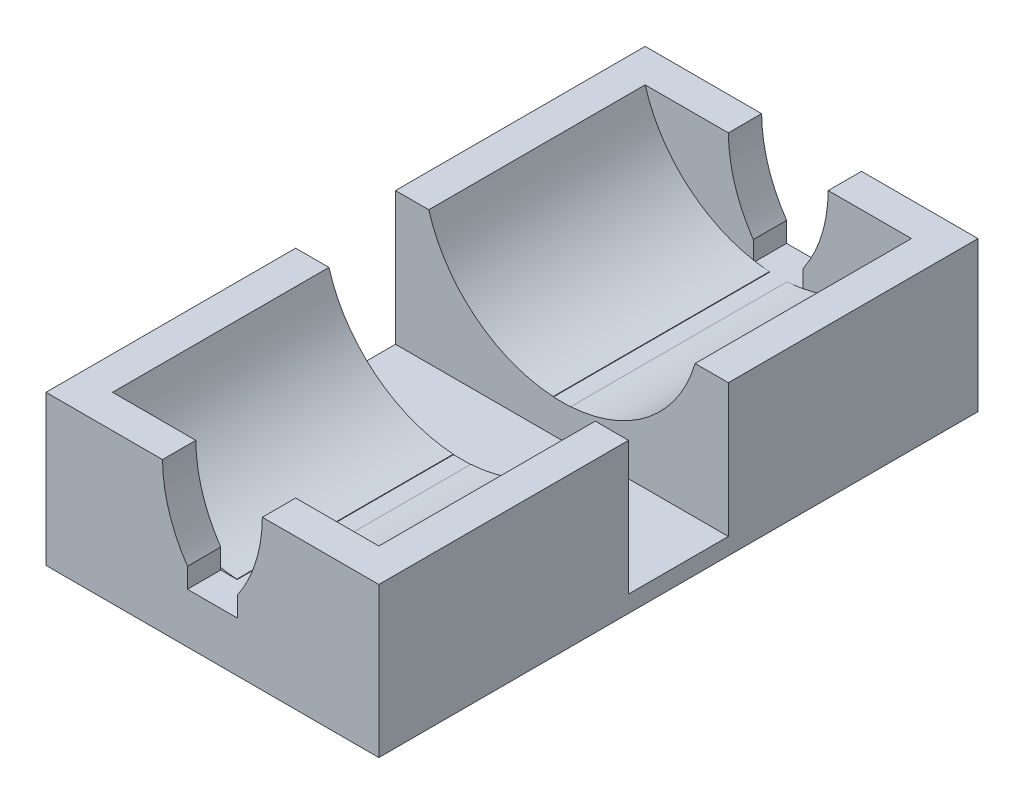
ISO-10303-21;
HEADER;
FILE_DESCRIPTION(('STEP AP214'),'2;1');
FILE_NAME('part.step','',(''),(''),'','','');
FILE_SCHEMA(('AUTOMOTIVE_DESIGN { 1 0 10303 214 1 1 1 1 }'));
ENDSEC;
DATA;
#1=APPLICATION_CONTEXT('core data for automotive mechanical design processes');
#2=APPLICATION_PROTOCOL_DEFINITION('international standard','automotive_design',2000,#1);
#3=PRODUCT_CONTEXT('',#1,'mechanical');
#4=PRODUCT('Part','Part','',(#3));
#5=PRODUCT_RELATED_PRODUCT_CATEGORY('part','',(#4));
#6=PRODUCT_DEFINITION_FORMATION('','',#4);
#7=PRODUCT_DEFINITION_CONTEXT('part definition',#1,'design');
#8=PRODUCT_DEFINITION('design','',#6,#7);
#9=PRODUCT_DEFINITION_SHAPE('','',#8);
#10=(LENGTH_UNIT() NAMED_UNIT(*) SI_UNIT(.MILLI.,.METRE.));
#11=(NAMED_UNIT(*) PLANE_ANGLE_UNIT() SI_UNIT($,.RADIAN.));
#12=(NAMED_UNIT(*) SI_UNIT($,.STERADIAN.) SOLID_ANGLE_UNIT());
#13=UNCERTAINTY_MEASURE_WITH_UNIT(LENGTH_MEASURE(1.E-05),#10,'distance_accuracy_value','');
#14=(GEOMETRIC_REPRESENTATION_CONTEXT(3) GLOBAL_UNCERTAINTY_ASSIGNED_CONTEXT((#13)) GLOBAL_UNIT_ASSIGNED_CONTEXT((#10,
#11,#12)) REPRESENTATION_CONTEXT('',''));
#15=CARTESIAN_POINT('',(0.,0.,0.));
#16=DIRECTION('',(0.,0.,1.));
#17=DIRECTION('',(1.,0.,0.));
#18=AXIS2_PLACEMENT_3D('',#15,#16,#17);
#19=CARTESIAN_POINT('',(-135.,56.7125441861068,120.893267690185));
#20=DIRECTION('',(0.,0.,-1.));
#21=DIRECTION('',(-1.,0.,0.));
#22=AXIS2_PLACEMENT_3D('',#19,#20,#21);
#23=CYLINDRICAL_SURFACE('',#22,41.6666666666667);
#24=CARTESIAN_POINT('',(-135.,56.7125441861068,-30.));
#25=DIRECTION('',(0.,0.,1.));
#26=DIRECTION('',(1.,0.,0.));
#27=AXIS2_PLACEMENT_3D('',#24,#25,#26);
#28=CIRCLE('',#27,41.6666666666667);
#29=CARTESIAN_POINT('',(-132.354628593983,15.12993819231,-30.));
#30=VERTEX_POINT('',#29);
#31=CARTESIAN_POINT('',(-95.,45.0458775194401,-30.));
#32=VERTEX_POINT('',#31);
#33=EDGE_CURVE('E596',#30,#32,#28,.T.);
#34=ORIENTED_EDGE('',*,*,#33,.F.);
#35=DIRECTION('',(0.,0.,1.));
#36=VECTOR('',#35,1.);
#37=CARTESIAN_POINT('',(-132.354628593983,15.12993819231,-45.));
#38=LINE('',#37,#36);
#39=CARTESIAN_POINT('',(-132.354628593983,15.12993819231,35.));
#40=VERTEX_POINT('',#39);
#41=EDGE_CURVE('E653',#30,#40,#38,.T.);
#42=ORIENTED_EDGE('',*,*,#41,.T.);
#43=CARTESIAN_POINT('',(-135.,56.7125441861068,35.));
#44=DIRECTION('',(0.,0.,1.));
#45=DIRECTION('',(1.,0.,0.));
#46=AXIS2_PLACEMENT_3D('',#43,#44,#45);
#47=CIRCLE('',#46,41.6666666666667);
#48=CARTESIAN_POINT('',(-127.5,15.726435428247,35.));
#49=VERTEX_POINT('',#48);
#50=EDGE_CURVE('E419',#40,#49,#47,.T.);
#51=ORIENTED_EDGE('',*,*,#50,.T.);
#52=CARTESIAN_POINT('',(-95.,45.0458775194401,35.));
#53=VERTEX_POINT('',#52);
#54=EDGE_CURVE('E601',#49,#53,#47,.T.);
#55=ORIENTED_EDGE('',*,*,#54,.T.);
#56=DIRECTION('',(0.,0.,1.));
#57=VECTOR('',#56,1.);
#58=CARTESIAN_POINT('',(-95.,45.0458775194401,35.));
#59=LINE('',#58,#57);
#60=EDGE_CURVE('E466',#32,#53,#59,.T.);
#61=ORIENTED_EDGE('',*,*,#60,.F.);
#62=EDGE_LOOP('',(#34,#42,#51,#55,#61));
#63=FACE_BOUND('',#62,.T.);
#64=ADVANCED_FACE('F43',(#63),#23,.F.);
#65=CARTESIAN_POINT('',(-185.,15.0458775194401,-135.));
#66=DIRECTION('',(0.,0.,1.));
#67=DIRECTION('',(1.,0.,0.));
#68=AXIS2_PLACEMENT_3D('',#65,#66,#67);
#69=PLANE('',#68);
#70=CARTESIAN_POINT('',(-163.040609981597,45.3116426667176,-135.));
#71=DIRECTION('',(0.,0.,1.));
#72=DIRECTION('',(1.,0.,0.));
#73=AXIS2_PLACEMENT_3D('',#70,#71,#72);
#74=CIRCLE('',#73,43.0414304908823);
#75=CARTESIAN_POINT('',(-120.,45.0458775194401,-135.));
#76=VERTEX_POINT('',#75);
#77=CARTESIAN_POINT('',(-127.5,21.0334676768741,-135.));
#78=VERTEX_POINT('',#77);
#79=EDGE_CURVE('E266',#76,#78,#74,.F.);
#80=ORIENTED_EDGE('',*,*,#79,.F.);
#81=DIRECTION('',(-1.,0.,0.));
#82=VECTOR('',#81,1.);
#83=CARTESIAN_POINT('',(-127.5,45.0458775194401,-135.));
#84=LINE('',#83,#82);
#85=CARTESIAN_POINT('',(-85.,45.0458775194401,-135.));
#86=VERTEX_POINT('',#85);
#87=EDGE_CURVE('E280',#86,#76,#84,.T.);
#88=ORIENTED_EDGE('',*,*,#87,.F.);
#89=DIRECTION('',(0.,-1.,0.));
#90=VECTOR('',#89,1.);
#91=CARTESIAN_POINT('',(-85.,45.0458775194401,-135.));
#92=LINE('',#91,#90);
#93=CARTESIAN_POINT('',(-85.,0.,-135.));
#94=VERTEX_POINT('',#93);
#95=EDGE_CURVE('E320',#86,#94,#92,.T.);
#96=ORIENTED_EDGE('',*,*,#95,.T.);
#97=DIRECTION('',(-1.,0.,0.));
#98=VECTOR('',#97,1.);
#99=CARTESIAN_POINT('',(-185.,0.,-135.));
#100=LINE('',#99,#98);
#101=CARTESIAN_POINT('',(-185.,0.,-135.));
#102=VERTEX_POINT('',#101);
#103=EDGE_CURVE('E393',#94,#102,#100,.T.);
#104=ORIENTED_EDGE('',*,*,#103,.T.);
#105=DIRECTION('',(0.,-1.,0.));
#106=VECTOR('',#105,1.);
#107=CARTESIAN_POINT('',(-185.,15.0458775194401,-135.));
#108=LINE('',#107,#106);
#109=CARTESIAN_POINT('',(-185.,45.0458775194401,-135.));
#110=VERTEX_POINT('',#109);
#111=EDGE_CURVE('E392',#110,#102,#108,.T.);
#112=ORIENTED_EDGE('',*,*,#111,.F.);
#113=DIRECTION('',(-1.,0.,0.));
#114=VECTOR('',#113,1.);
#115=CARTESIAN_POINT('',(-185.,45.0458775194401,-135.));
#116=LINE('',#115,#114);
#117=CARTESIAN_POINT('',(-150.,45.0458775194401,-135.));
#118=VERTEX_POINT('',#117);
#119=EDGE_CURVE('E332',#118,#110,#116,.T.);
#120=ORIENTED_EDGE('',*,*,#119,.F.);
#121=CARTESIAN_POINT('',(-106.959390018403,45.3116426667176,-135.));
#122=DIRECTION('',(0.,0.,1.));
#123=DIRECTION('',(1.,0.,0.));
#124=AXIS2_PLACEMENT_3D('',#121,#122,#123);
#125=CIRCLE('',#124,43.0414304908823);
#126=CARTESIAN_POINT('',(-142.5,21.0334676768742,-135.));
#127=VERTEX_POINT('',#126);
#128=EDGE_CURVE('E67',#118,#127,#125,.T.);
#129=ORIENTED_EDGE('',*,*,#128,.T.);
#130=DIRECTION('',(0.,-1.,0.));
#131=VECTOR('',#130,1.);
#132=CARTESIAN_POINT('',(-142.5,45.0458775194401,-135.));
#133=LINE('',#132,#131);
#134=CARTESIAN_POINT('',(-142.5,15.0458775194401,-135.));
#135=VERTEX_POINT('',#134);
#136=EDGE_CURVE('E348',#127,#135,#133,.T.);
#137=ORIENTED_EDGE('',*,*,#136,.T.);
#138=DIRECTION('',(-1.,0.,0.));
#139=VECTOR('',#138,1.);
#140=CARTESIAN_POINT('',(-185.,15.0458775194401,-135.));
#141=LINE('',#140,#139);
#142=CARTESIAN_POINT('',(-127.5,15.0458775194401,-135.));
#143=VERTEX_POINT('',#142);
#144=EDGE_CURVE('E389',#143,#135,#141,.T.);
#145=ORIENTED_EDGE('',*,*,#144,.F.);
#146=DIRECTION('',(0.,-1.,0.));
#147=VECTOR('',#146,1.);
#148=CARTESIAN_POINT('',(-127.5,45.0458775194401,-135.));
#149=LINE('',#148,#147);
#150=EDGE_CURVE('E283',#78,#143,#149,.T.);
#151=ORIENTED_EDGE('',*,*,#150,.F.);
#152=EDGE_LOOP('',(#80,#88,#96,#104,#112,#120,#129,#137,#145,#151));
#153=FACE_BOUND('',#152,.T.);
#154=ADVANCED_FACE('F279',(#153),#69,.F.);
#155=CARTESIAN_POINT('',(-175.,45.0458775194401,-30.));
#156=DIRECTION('',(0.,0.,1.));
#157=DIRECTION('',(1.,0.,0.));
#158=AXIS2_PLACEMENT_3D('',#155,#156,#157);
#159=PLANE('',#158);
#160=CARTESIAN_POINT('',(-163.040609981597,45.3116426667176,-30.));
#161=DIRECTION('',(0.,0.,1.));
#162=DIRECTION('',(1.,0.,0.));
#163=AXIS2_PLACEMENT_3D('',#160,#161,#162);
#164=CIRCLE('',#163,43.0414304908823);
#165=CARTESIAN_POINT('',(-132.437534993104,15.0458775194401,-30.));
#166=VERTEX_POINT('',#165);
#167=EDGE_CURVE('E650',#30,#166,#164,.F.);
#168=ORIENTED_EDGE('',*,*,#167,.F.);
#169=ORIENTED_EDGE('',*,*,#33,.T.);
#170=DIRECTION('',(-1.,0.,0.));
#171=VECTOR('',#170,1.);
#172=CARTESIAN_POINT('',(-95.,45.0458775194401,-30.));
#173=LINE('',#172,#171);
#174=CARTESIAN_POINT('',(-85.,45.0458775194401,-30.));
#175=VERTEX_POINT('',#174);
#176=EDGE_CURVE('E462',#175,#32,#173,.T.);
#177=ORIENTED_EDGE('',*,*,#176,.F.);
#178=DIRECTION('',(0.,-1.,0.));
#179=VECTOR('',#178,1.);
#180=CARTESIAN_POINT('',(-85.,45.0458775194401,-30.));
#181=LINE('',#180,#179);
#182=CARTESIAN_POINT('',(-85.,5.04587751944009,-30.));
#183=VERTEX_POINT('',#182);
#184=EDGE_CURVE('E483',#175,#183,#181,.T.);
#185=ORIENTED_EDGE('',*,*,#184,.T.);
#186=DIRECTION('',(1.,0.,0.));
#187=VECTOR('',#186,1.);
#188=CARTESIAN_POINT('',(-185.,5.04587751944009,-30.));
#189=LINE('',#188,#187);
#190=CARTESIAN_POINT('',(-185.,5.04587751944009,-30.));
#191=VERTEX_POINT('',#190);
#192=EDGE_CURVE('E580',#191,#183,#189,.T.);
#193=ORIENTED_EDGE('',*,*,#192,.F.);
#194=DIRECTION('',(0.,-1.,0.));
#195=VECTOR('',#194,1.);
#196=CARTESIAN_POINT('',(-185.,45.0458775194401,-30.));
#197=LINE('',#196,#195);
#198=CARTESIAN_POINT('',(-185.,45.0458775194401,-30.));
#199=VERTEX_POINT('',#198);
#200=EDGE_CURVE('E385',#199,#191,#197,.T.);
#201=ORIENTED_EDGE('',*,*,#200,.F.);
#202=DIRECTION('',(-1.,0.,0.));
#203=VECTOR('',#202,1.);
#204=CARTESIAN_POINT('',(-175.,45.0458775194401,-30.));
#205=LINE('',#204,#203);
#206=CARTESIAN_POINT('',(-175.,45.0458775194401,-30.));
#207=VERTEX_POINT('',#206);
#208=EDGE_CURVE('E363',#207,#199,#205,.T.);
#209=ORIENTED_EDGE('',*,*,#208,.F.);
#210=CARTESIAN_POINT('',(-137.645371406017,15.12993819231,-30.));
#211=VERTEX_POINT('',#210);
#212=EDGE_CURVE('E597',#207,#211,#28,.T.);
#213=ORIENTED_EDGE('',*,*,#212,.T.);
#214=CARTESIAN_POINT('',(-106.959390018403,45.3116426667176,-30.));
#215=DIRECTION('',(0.,0.,1.));
#216=DIRECTION('',(1.,0.,0.));
#217=AXIS2_PLACEMENT_3D('',#214,#215,#216);
#218=CIRCLE('',#217,43.0414304908823);
#219=CARTESIAN_POINT('',(-137.562465006895,15.0458775194401,-30.));
#220=VERTEX_POINT('',#219);
#221=EDGE_CURVE('E540',#211,#220,#218,.T.);
#222=ORIENTED_EDGE('',*,*,#221,.T.);
#223=DIRECTION('',(-1.,0.,0.));
#224=VECTOR('',#223,1.);
#225=CARTESIAN_POINT('',(-175.,15.0458775194401,-30.));
#226=LINE('',#225,#224);
#227=EDGE_CURVE('E656',#166,#220,#226,.T.);
#228=ORIENTED_EDGE('',*,*,#227,.F.);
#229=EDGE_LOOP('',(#168,#169,#177,#185,#193,#201,#209,#213,#222,#228));
#230=FACE_BOUND('',#229,.T.);
#231=ADVANCED_FACE('F704',(#230),#159,.F.);
#232=CARTESIAN_POINT('',(-185.,45.0458775194401,45.));
#233=DIRECTION('',(0.,0.,-1.));
#234=DIRECTION('',(-1.,0.,0.));
#235=AXIS2_PLACEMENT_3D('',#232,#233,#234);
#236=PLANE('',#235);
#237=CARTESIAN_POINT('',(-163.040609981597,45.3116426667176,45.0000000000001));
#238=DIRECTION('',(0.,0.,1.));
#239=DIRECTION('',(1.,0.,0.));
#240=AXIS2_PLACEMENT_3D('',#237,#238,#239);
#241=CIRCLE('',#240,43.0414304908823);
#242=CARTESIAN_POINT('',(-120.,45.0458775194401,45.));
#243=VERTEX_POINT('',#242);
#244=CARTESIAN_POINT('',(-127.5,21.0334676768741,45.0000000000001));
#245=VERTEX_POINT('',#244);
#246=EDGE_CURVE('E674',#243,#245,#241,.F.);
#247=ORIENTED_EDGE('',*,*,#246,.T.);
#248=DIRECTION('',(0.,-1.,0.));
#249=VECTOR('',#248,1.);
#250=CARTESIAN_POINT('',(-127.5,45.0458775194401,45.));
#251=LINE('',#250,#249);
#252=CARTESIAN_POINT('',(-127.5,15.0458775194401,45.));
#253=VERTEX_POINT('',#252);
#254=EDGE_CURVE('E474',#245,#253,#251,.T.);
#255=ORIENTED_EDGE('',*,*,#254,.T.);
#256=DIRECTION('',(1.,0.,0.));
#257=VECTOR('',#256,1.);
#258=CARTESIAN_POINT('',(0.,15.0458775194401,45.));
#259=LINE('',#258,#257);
#260=CARTESIAN_POINT('',(-142.5,15.0458775194401,45.));
#261=VERTEX_POINT('',#260);
#262=EDGE_CURVE('E588',#261,#253,#259,.T.);
#263=ORIENTED_EDGE('',*,*,#262,.F.);
#264=DIRECTION('',(0.,-1.,0.));
#265=VECTOR('',#264,1.);
#266=CARTESIAN_POINT('',(-142.5,45.0458775194401,45.));
#267=LINE('',#266,#265);
#268=CARTESIAN_POINT('',(-142.5,21.0334676768741,45.0000000000001));
#269=VERTEX_POINT('',#268);
#270=EDGE_CURVE('E379',#269,#261,#267,.T.);
#271=ORIENTED_EDGE('',*,*,#270,.F.);
#272=CARTESIAN_POINT('',(-106.959390018403,45.3116426667176,45.0000000000001));
#273=DIRECTION('',(0.,0.,1.));
#274=DIRECTION('',(1.,0.,0.));
#275=AXIS2_PLACEMENT_3D('',#272,#273,#274);
#276=CIRCLE('',#275,43.0414304908823);
#277=CARTESIAN_POINT('',(-150.,45.0458775194401,45.0000000000001));
#278=VERTEX_POINT('',#277);
#279=EDGE_CURVE('E285',#278,#269,#276,.T.);
#280=ORIENTED_EDGE('',*,*,#279,.F.);
#281=DIRECTION('',(1.,0.,0.));
#282=VECTOR('',#281,1.);
#283=CARTESIAN_POINT('',(-185.,45.0458775194401,45.));
#284=LINE('',#283,#282);
#285=CARTESIAN_POINT('',(-185.,45.0458775194401,45.));
#286=VERTEX_POINT('',#285);
#287=EDGE_CURVE('E369',#286,#278,#284,.T.);
#288=ORIENTED_EDGE('',*,*,#287,.F.);
#289=DIRECTION('',(0.,-1.,0.));
#290=VECTOR('',#289,1.);
#291=CARTESIAN_POINT('',(-185.,45.0458775194401,45.));
#292=LINE('',#291,#290);
#293=CARTESIAN_POINT('',(-185.,0.,45.));
#294=VERTEX_POINT('',#293);
#295=EDGE_CURVE('E382',#286,#294,#292,.T.);
#296=ORIENTED_EDGE('',*,*,#295,.T.);
#297=DIRECTION('',(-1.,0.,0.));
#298=VECTOR('',#297,1.);
#299=CARTESIAN_POINT('',(5.00000000000003,0.,45.));
#300=LINE('',#299,#298);
#301=CARTESIAN_POINT('',(-85.,0.,45.));
#302=VERTEX_POINT('',#301);
#303=EDGE_CURVE('E406',#302,#294,#300,.T.);
#304=ORIENTED_EDGE('',*,*,#303,.F.);
#305=DIRECTION('',(0.,-1.,0.));
#306=VECTOR('',#305,1.);
#307=CARTESIAN_POINT('',(-85.,45.0458775194401,45.));
#308=LINE('',#307,#306);
#309=CARTESIAN_POINT('',(-85.,45.0458775194401,45.));
#310=VERTEX_POINT('',#309);
#311=EDGE_CURVE('E312',#310,#302,#308,.T.);
#312=ORIENTED_EDGE('',*,*,#311,.F.);
#313=DIRECTION('',(1.,0.,0.));
#314=VECTOR('',#313,1.);
#315=CARTESIAN_POINT('',(-127.5,45.0458775194401,45.));
#316=LINE('',#315,#314);
#317=EDGE_CURVE('E456',#243,#310,#316,.T.);
#318=ORIENTED_EDGE('',*,*,#317,.F.);
#319=EDGE_LOOP('',(#247,#255,#263,#271,#280,#288,#296,#304,#312,#318));
#320=FACE_BOUND('',#319,.T.);
#321=ADVANCED_FACE('F497',(#320),#236,.F.);
#322=CARTESIAN_POINT('',(-175.,45.0458775194401,-60.));
#323=DIRECTION('',(0.,0.,-1.));
#324=DIRECTION('',(-1.,0.,0.));
#325=AXIS2_PLACEMENT_3D('',#322,#323,#324);
#326=PLANE('',#325);
#327=CARTESIAN_POINT('',(-163.040609981597,45.3116426667176,-60.));
#328=DIRECTION('',(0.,0.,-1.));
#329=DIRECTION('',(-1.,0.,0.));
#330=AXIS2_PLACEMENT_3D('',#327,#328,#329);
#331=CIRCLE('',#330,43.0414304908823);
#332=CARTESIAN_POINT('',(-132.437534993104,15.0458775194401,-60.));
#333=VERTEX_POINT('',#332);
#334=CARTESIAN_POINT('',(-132.354628593983,15.12993819231,-60.));
#335=VERTEX_POINT('',#334);
#336=EDGE_CURVE('E638',#333,#335,#331,.F.);
#337=ORIENTED_EDGE('',*,*,#336,.F.);
#338=DIRECTION('',(1.,0.,0.));
#339=VECTOR('',#338,1.);
#340=CARTESIAN_POINT('',(-175.,15.0458775194401,-60.));
#341=LINE('',#340,#339);
#342=CARTESIAN_POINT('',(-137.562465006895,15.0458775194401,-60.));
#343=VERTEX_POINT('',#342);
#344=EDGE_CURVE('E659',#343,#333,#341,.T.);
#345=ORIENTED_EDGE('',*,*,#344,.F.);
#346=CARTESIAN_POINT('',(-106.959390018403,45.3116426667176,-60.));
#347=DIRECTION('',(0.,0.,-1.));
#348=DIRECTION('',(-1.,0.,0.));
#349=AXIS2_PLACEMENT_3D('',#346,#347,#348);
#350=CIRCLE('',#349,43.0414304908823);
#351=CARTESIAN_POINT('',(-137.645371406017,15.12993819231,-60.));
#352=VERTEX_POINT('',#351);
#353=EDGE_CURVE('E556',#343,#352,#350,.T.);
#354=ORIENTED_EDGE('',*,*,#353,.T.);
#355=CARTESIAN_POINT('',(-135.,56.7125441861068,-60.));
#356=DIRECTION('',(0.,0.,-1.));
#357=DIRECTION('',(-1.,0.,0.));
#358=AXIS2_PLACEMENT_3D('',#355,#356,#357);
#359=CIRCLE('',#358,41.6666666666667);
#360=CARTESIAN_POINT('',(-175.,45.0458775194401,-60.));
#361=VERTEX_POINT('',#360);
#362=EDGE_CURVE('E591',#352,#361,#359,.T.);
#363=ORIENTED_EDGE('',*,*,#362,.T.);
#364=DIRECTION('',(1.,0.,0.));
#365=VECTOR('',#364,1.);
#366=CARTESIAN_POINT('',(-175.,45.0458775194401,-60.));
#367=LINE('',#366,#365);
#368=CARTESIAN_POINT('',(-185.,45.0458775194401,-60.));
#369=VERTEX_POINT('',#368);
#370=EDGE_CURVE('E338',#369,#361,#367,.T.);
#371=ORIENTED_EDGE('',*,*,#370,.F.);
#372=DIRECTION('',(0.,-1.,0.));
#373=VECTOR('',#372,1.);
#374=CARTESIAN_POINT('',(-185.,45.0458775194401,-60.));
#375=LINE('',#374,#373);
#376=CARTESIAN_POINT('',(-185.,5.04587751944009,-60.));
#377=VERTEX_POINT('',#376);
#378=EDGE_CURVE('E342',#369,#377,#375,.T.);
#379=ORIENTED_EDGE('',*,*,#378,.T.);
#380=DIRECTION('',(-1.,0.,0.));
#381=VECTOR('',#380,1.);
#382=CARTESIAN_POINT('',(-135.,5.04587751944009,-60.));
#383=LINE('',#382,#381);
#384=CARTESIAN_POINT('',(-85.,5.04587751944009,-60.));
#385=VERTEX_POINT('',#384);
#386=EDGE_CURVE('E572',#385,#377,#383,.T.);
#387=ORIENTED_EDGE('',*,*,#386,.F.);
#388=DIRECTION('',(0.,-1.,0.));
#389=VECTOR('',#388,1.);
#390=CARTESIAN_POINT('',(-85.,45.0458775194401,-60.));
#391=LINE('',#390,#389);
#392=CARTESIAN_POINT('',(-85.,45.0458775194401,-60.));
#393=VERTEX_POINT('',#392);
#394=EDGE_CURVE('E308',#393,#385,#391,.T.);
#395=ORIENTED_EDGE('',*,*,#394,.F.);
#396=DIRECTION('',(1.,0.,0.));
#397=VECTOR('',#396,1.);
#398=CARTESIAN_POINT('',(-95.,45.0458775194401,-60.));
#399=LINE('',#398,#397);
#400=CARTESIAN_POINT('',(-95.,45.0458775194401,-60.));
#401=VERTEX_POINT('',#400);
#402=EDGE_CURVE('E305',#401,#393,#399,.T.);
#403=ORIENTED_EDGE('',*,*,#402,.F.);
#404=EDGE_CURVE('E592',#401,#335,#359,.T.);
#405=ORIENTED_EDGE('',*,*,#404,.T.);
#406=EDGE_LOOP('',(#337,#345,#354,#363,#371,#379,#387,#395,#403,#405));
#407=FACE_BOUND('',#406,.T.);
#408=ADVANCED_FACE('F757',(#407),#326,.F.);
#409=CARTESIAN_POINT('',(-127.5,45.0458775194401,-135.));
#410=DIRECTION('',(1.,0.,0.));
#411=DIRECTION('',(0.,0.,-1.));
#412=AXIS2_PLACEMENT_3D('',#409,#410,#411);
#413=PLANE('',#412);
#414=DIRECTION('',(0.,0.,1.));
#415=VECTOR('',#414,1.);
#416=CARTESIAN_POINT('',(-127.5,21.0334676768741,-135.));
#417=LINE('',#416,#415);
#418=CARTESIAN_POINT('',(-127.5,21.0334676768741,-125.));
#419=VERTEX_POINT('',#418);
#420=EDGE_CURVE('E534',#78,#419,#417,.T.);
#421=ORIENTED_EDGE('',*,*,#420,.F.);
#422=ORIENTED_EDGE('',*,*,#150,.T.);
#423=DIRECTION('',(0.,0.,1.));
#424=VECTOR('',#423,1.);
#425=CARTESIAN_POINT('',(-127.5,15.0458775194401,-135.));
#426=LINE('',#425,#424);
#427=CARTESIAN_POINT('',(-127.5,15.0458775194401,-125.));
#428=VERTEX_POINT('',#427);
#429=EDGE_CURVE('E298',#143,#428,#426,.T.);
#430=ORIENTED_EDGE('',*,*,#429,.T.);
#431=DIRECTION('',(0.,-1.,0.));
#432=VECTOR('',#431,1.);
#433=CARTESIAN_POINT('',(-127.5,45.0458775194401,-125.));
#434=LINE('',#433,#432);
#435=CARTESIAN_POINT('',(-127.5,15.726435428247,-125.));
#436=VERTEX_POINT('',#435);
#437=EDGE_CURVE('E444',#436,#428,#434,.T.);
#438=ORIENTED_EDGE('',*,*,#437,.F.);
#439=DIRECTION('',(0.,-1.,0.));
#440=VECTOR('',#439,1.);
#441=CARTESIAN_POINT('',(-127.5,45.0458775194401,-125.));
#442=LINE('',#441,#440);
#443=EDGE_CURVE('E315',#419,#436,#442,.T.);
#444=ORIENTED_EDGE('',*,*,#443,.F.);
#445=EDGE_LOOP('',(#421,#422,#430,#438,#444));
#446=FACE_BOUND('',#445,.T.);
#447=ADVANCED_FACE('F532',(#446),#413,.F.);
#448=CARTESIAN_POINT('',(-127.5,45.0458775194401,-125.));
#449=DIRECTION('',(0.,0.,-1.));
#450=DIRECTION('',(-1.,0.,0.));
#451=AXIS2_PLACEMENT_3D('',#448,#449,#450);
#452=PLANE('',#451);
#453=CARTESIAN_POINT('',(-163.040609981597,45.3116426667176,-125.));
#454=DIRECTION('',(0.,0.,-1.));
#455=DIRECTION('',(-1.,0.,0.));
#456=AXIS2_PLACEMENT_3D('',#453,#454,#455);
#457=CIRCLE('',#456,43.0414304908823);
#458=CARTESIAN_POINT('',(-120.,45.0458775194401,-125.));
#459=VERTEX_POINT('',#458);
#460=EDGE_CURVE('E269',#419,#459,#457,.F.);
#461=ORIENTED_EDGE('',*,*,#460,.F.);
#462=ORIENTED_EDGE('',*,*,#443,.T.);
#463=CARTESIAN_POINT('',(-135.,56.7125441861068,-125.));
#464=DIRECTION('',(0.,0.,1.));
#465=DIRECTION('',(1.,0.,0.));
#466=AXIS2_PLACEMENT_3D('',#463,#464,#465);
#467=CIRCLE('',#466,41.6666666666667);
#468=CARTESIAN_POINT('',(-95.,45.0458775194401,-125.));
#469=VERTEX_POINT('',#468);
#470=EDGE_CURVE('E609',#436,#469,#467,.T.);
#471=ORIENTED_EDGE('',*,*,#470,.T.);
#472=DIRECTION('',(1.,0.,0.));
#473=VECTOR('',#472,1.);
#474=CARTESIAN_POINT('',(-127.5,45.0458775194401,-125.));
#475=LINE('',#474,#473);
#476=EDGE_CURVE('E292',#459,#469,#475,.T.);
#477=ORIENTED_EDGE('',*,*,#476,.F.);
#478=EDGE_LOOP('',(#461,#462,#471,#477));
#479=FACE_BOUND('',#478,.T.);
#480=ADVANCED_FACE('F786',(#479),#452,.F.);
#481=CARTESIAN_POINT('',(0.,45.0458775194401,0.));
#482=DIRECTION('',(0.,-1.,0.));
#483=DIRECTION('',(0.,0.,-1.));
#484=AXIS2_PLACEMENT_3D('',#481,#482,#483);
#485=PLANE('',#484);
#486=DIRECTION('',(0.,0.,1.));
#487=VECTOR('',#486,1.);
#488=CARTESIAN_POINT('',(-120.,45.0458775194401,-135.));
#489=LINE('',#488,#487);
#490=EDGE_CURVE('E263',#76,#459,#489,.T.);
#491=ORIENTED_EDGE('',*,*,#490,.T.);
#492=ORIENTED_EDGE('',*,*,#476,.T.);
#493=DIRECTION('',(0.,0.,1.));
#494=VECTOR('',#493,1.);
#495=CARTESIAN_POINT('',(-95.,45.0458775194401,-60.));
#496=LINE('',#495,#494);
#497=EDGE_CURVE('E296',#469,#401,#496,.T.);
#498=ORIENTED_EDGE('',*,*,#497,.T.);
#499=ORIENTED_EDGE('',*,*,#402,.T.);
#500=DIRECTION('',(0.,0.,-1.));
#501=VECTOR('',#500,1.);
#502=CARTESIAN_POINT('',(-85.,45.0458775194401,-60.));
#503=LINE('',#502,#501);
#504=EDGE_CURVE('E289',#393,#86,#503,.T.);
#505=ORIENTED_EDGE('',*,*,#504,.T.);
#506=ORIENTED_EDGE('',*,*,#87,.T.);
#507=EDGE_LOOP('',(#491,#492,#498,#499,#505,#506));
#508=FACE_BOUND('',#507,.T.);
#509=ADVANCED_FACE('F287',(#508),#485,.F.);
#510=CARTESIAN_POINT('',(-127.5,45.0458775194401,35.));
#511=DIRECTION('',(0.,0.,1.));
#512=DIRECTION('',(1.,0.,0.));
#513=AXIS2_PLACEMENT_3D('',#510,#511,#512);
#514=PLANE('',#513);
#515=CARTESIAN_POINT('',(-163.040609981597,45.3116426667176,35.));
#516=DIRECTION('',(0.,0.,1.));
#517=DIRECTION('',(1.,0.,0.));
#518=AXIS2_PLACEMENT_3D('',#515,#516,#517);
#519=CIRCLE('',#518,43.0414304908823);
#520=CARTESIAN_POINT('',(-120.,45.0458775194401,35.));
#521=VERTEX_POINT('',#520);
#522=CARTESIAN_POINT('',(-127.5,21.0334676768741,35.));
#523=VERTEX_POINT('',#522);
#524=EDGE_CURVE('E542',#521,#523,#519,.F.);
#525=ORIENTED_EDGE('',*,*,#524,.F.);
#526=DIRECTION('',(-1.,0.,0.));
#527=VECTOR('',#526,1.);
#528=CARTESIAN_POINT('',(-127.5,45.0458775194401,35.));
#529=LINE('',#528,#527);
#530=EDGE_CURVE('E470',#53,#521,#529,.T.);
#531=ORIENTED_EDGE('',*,*,#530,.F.);
#532=ORIENTED_EDGE('',*,*,#54,.F.);
#533=DIRECTION('',(0.,-1.,0.));
#534=VECTOR('',#533,1.);
#535=CARTESIAN_POINT('',(-127.5,45.0458775194401,35.));
#536=LINE('',#535,#534);
#537=EDGE_CURVE('E480',#523,#49,#536,.T.);
#538=ORIENTED_EDGE('',*,*,#537,.F.);
#539=EDGE_LOOP('',(#525,#531,#532,#538));
#540=FACE_BOUND('',#539,.T.);
#541=ADVANCED_FACE('F632',(#540),#514,.F.);
#542=CARTESIAN_POINT('',(-127.5,45.0458775194401,45.));
#543=DIRECTION('',(1.,0.,0.));
#544=DIRECTION('',(0.,0.,-1.));
#545=AXIS2_PLACEMENT_3D('',#542,#543,#544);
#546=PLANE('',#545);
#547=DIRECTION('',(0.,0.,1.));
#548=VECTOR('',#547,1.);
#549=CARTESIAN_POINT('',(-127.5,21.0334676768741,-135.));
#550=LINE('',#549,#548);
#551=EDGE_CURVE('E636',#523,#245,#550,.T.);
#552=ORIENTED_EDGE('',*,*,#551,.F.);
#553=ORIENTED_EDGE('',*,*,#537,.T.);
#554=DIRECTION('',(0.,-1.,0.));
#555=VECTOR('',#554,1.);
#556=CARTESIAN_POINT('',(-127.5,45.0458775194401,35.));
#557=LINE('',#556,#555);
#558=CARTESIAN_POINT('',(-127.5,15.0458775194401,35.));
#559=VERTEX_POINT('',#558);
#560=EDGE_CURVE('E432',#49,#559,#557,.T.);
#561=ORIENTED_EDGE('',*,*,#560,.T.);
#562=DIRECTION('',(0.,0.,1.));
#563=VECTOR('',#562,1.);
#564=CARTESIAN_POINT('',(-127.5,15.0458775194401,45.));
#565=LINE('',#564,#563);
#566=EDGE_CURVE('E429',#559,#253,#565,.T.);
#567=ORIENTED_EDGE('',*,*,#566,.T.);
#568=ORIENTED_EDGE('',*,*,#254,.F.);
#569=EDGE_LOOP('',(#552,#553,#561,#567,#568));
#570=FACE_BOUND('',#569,.T.);
#571=ADVANCED_FACE('F679',(#570),#546,.F.);
#572=CARTESIAN_POINT('',(0.,45.0458775194401,0.));
#573=DIRECTION('',(0.,1.,0.));
#574=DIRECTION('',(0.,0.,1.));
#575=AXIS2_PLACEMENT_3D('',#572,#573,#574);
#576=PLANE('',#575);
#577=ORIENTED_EDGE('',*,*,#530,.T.);
#578=EDGE_CURVE('E275',#521,#243,#489,.T.);
#579=ORIENTED_EDGE('',*,*,#578,.T.);
#580=ORIENTED_EDGE('',*,*,#317,.T.);
#581=DIRECTION('',(0.,0.,-1.));
#582=VECTOR('',#581,1.);
#583=CARTESIAN_POINT('',(-85.,45.0458775194401,45.));
#584=LINE('',#583,#582);
#585=EDGE_CURVE('E459',#310,#175,#584,.T.);
#586=ORIENTED_EDGE('',*,*,#585,.T.);
#587=ORIENTED_EDGE('',*,*,#176,.T.);
#588=ORIENTED_EDGE('',*,*,#60,.T.);
#589=EDGE_LOOP('',(#577,#579,#580,#586,#587,#588));
#590=FACE_BOUND('',#589,.T.);
#591=ADVANCED_FACE('F628',(#590),#576,.T.);
#592=CARTESIAN_POINT('',(0.,0.,-125.));
#593=DIRECTION('',(0.,0.,1.));
#594=DIRECTION('',(1.,0.,0.));
#595=AXIS2_PLACEMENT_3D('',#592,#593,#594);
#596=PLANE('',#595);
#597=CARTESIAN_POINT('',(-163.040609981597,45.3116426667176,-125.));
#598=DIRECTION('',(0.,0.,1.));
#599=DIRECTION('',(1.,0.,0.));
#600=AXIS2_PLACEMENT_3D('',#597,#598,#599);
#601=CIRCLE('',#600,43.0414304908823);
#602=CARTESIAN_POINT('',(-132.354628593983,15.12993819231,-125.));
#603=VERTEX_POINT('',#602);
#604=CARTESIAN_POINT('',(-132.437534993104,15.0458775194401,-125.));
#605=VERTEX_POINT('',#604);
#606=EDGE_CURVE('E643',#603,#605,#601,.F.);
#607=ORIENTED_EDGE('',*,*,#606,.F.);
#608=EDGE_CURVE('E605',#603,#436,#467,.T.);
#609=ORIENTED_EDGE('',*,*,#608,.T.);
#610=ORIENTED_EDGE('',*,*,#437,.T.);
#611=DIRECTION('',(-1.,0.,0.));
#612=VECTOR('',#611,1.);
#613=CARTESIAN_POINT('',(5.00000000000003,15.0458775194401,-125.));
#614=LINE('',#613,#612);
#615=EDGE_CURVE('E447',#428,#605,#614,.T.);
#616=ORIENTED_EDGE('',*,*,#615,.T.);
#617=EDGE_LOOP('',(#607,#609,#610,#616));
#618=FACE_BOUND('',#617,.T.);
#619=ADVANCED_FACE('F708',(#618),#596,.F.);
#620=ORIENTED_EDGE('',*,*,#608,.F.);
#621=DIRECTION('',(0.,0.,1.));
#622=VECTOR('',#621,1.);
#623=CARTESIAN_POINT('',(-132.354628593983,15.12993819231,-45.));
#624=LINE('',#623,#622);
#625=EDGE_CURVE('E646',#603,#335,#624,.T.);
#626=ORIENTED_EDGE('',*,*,#625,.T.);
#627=ORIENTED_EDGE('',*,*,#404,.F.);
#628=ORIENTED_EDGE('',*,*,#497,.F.);
#629=ORIENTED_EDGE('',*,*,#470,.F.);
#630=EDGE_LOOP('',(#620,#626,#627,#628,#629));
#631=FACE_BOUND('',#630,.T.);
#632=ADVANCED_FACE('F699',(#631),#23,.F.);
#633=CARTESIAN_POINT('',(-175.,45.0458775194401,35.));
#634=DIRECTION('',(0.,0.,1.));
#635=DIRECTION('',(1.,0.,0.));
#636=AXIS2_PLACEMENT_3D('',#633,#634,#635);
#637=PLANE('',#636);
#638=ORIENTED_EDGE('',*,*,#50,.F.);
#639=CARTESIAN_POINT('',(-163.040609981597,45.3116426667176,35.));
#640=DIRECTION('',(0.,0.,1.));
#641=DIRECTION('',(1.,0.,0.));
#642=AXIS2_PLACEMENT_3D('',#639,#640,#641);
#643=CIRCLE('',#642,43.0414304908823);
#644=CARTESIAN_POINT('',(-132.437534993104,15.0458775194401,35.));
#645=VERTEX_POINT('',#644);
#646=EDGE_CURVE('E52',#40,#645,#643,.F.);
#647=ORIENTED_EDGE('',*,*,#646,.T.);
#648=DIRECTION('',(-1.,0.,0.));
#649=VECTOR('',#648,1.);
#650=CARTESIAN_POINT('',(5.00000000000003,15.0458775194401,35.));
#651=LINE('',#650,#649);
#652=EDGE_CURVE('E416',#559,#645,#651,.T.);
#653=ORIENTED_EDGE('',*,*,#652,.F.);
#654=ORIENTED_EDGE('',*,*,#560,.F.);
#655=EDGE_LOOP('',(#638,#647,#653,#654));
#656=FACE_BOUND('',#655,.T.);
#657=ADVANCED_FACE('F414',(#656),#637,.T.);
#658=CARTESIAN_POINT('',(5.00000000000003,15.0458775194401,153.052821927466));
#659=DIRECTION('',(0.,-1.,0.));
#660=DIRECTION('',(0.,0.,-1.));
#661=AXIS2_PLACEMENT_3D('',#658,#659,#660);
#662=PLANE('',#661);
#663=ORIENTED_EDGE('',*,*,#262,.T.);
#664=ORIENTED_EDGE('',*,*,#566,.F.);
#665=ORIENTED_EDGE('',*,*,#652,.T.);
#666=DIRECTION('',(0.,0.,1.));
#667=VECTOR('',#666,1.);
#668=CARTESIAN_POINT('',(-132.437534993104,15.0458775194401,-135.));
#669=LINE('',#668,#667);
#670=EDGE_CURVE('E426',#166,#645,#669,.T.);
#671=ORIENTED_EDGE('',*,*,#670,.F.);
#672=ORIENTED_EDGE('',*,*,#227,.T.);
#673=DIRECTION('',(0.,0.,1.));
#674=VECTOR('',#673,1.);
#675=CARTESIAN_POINT('',(-137.562465006895,15.0458775194401,-135.));
#676=LINE('',#675,#674);
#677=CARTESIAN_POINT('',(-137.562465006895,15.0458775194401,35.));
#678=VERTEX_POINT('',#677);
#679=EDGE_CURVE('E665',#220,#678,#676,.T.);
#680=ORIENTED_EDGE('',*,*,#679,.T.);
#681=CARTESIAN_POINT('',(-142.5,15.0458775194401,35.));
#682=VERTEX_POINT('',#681);
#683=EDGE_CURVE('E431',#678,#682,#651,.T.);
#684=ORIENTED_EDGE('',*,*,#683,.T.);
#685=DIRECTION('',(0.,0.,-1.));
#686=VECTOR('',#685,1.);
#687=CARTESIAN_POINT('',(-142.5,15.0458775194401,45.));
#688=LINE('',#687,#686);
#689=EDGE_CURVE('E355',#261,#682,#688,.T.);
#690=ORIENTED_EDGE('',*,*,#689,.F.);
#691=EDGE_LOOP('',(#663,#664,#665,#671,#672,#680,#684,#690));
#692=FACE_BOUND('',#691,.T.);
#693=ADVANCED_FACE('F425',(#692),#662,.F.);
#694=CARTESIAN_POINT('',(-185.,15.0458775194401,-135.));
#695=DIRECTION('',(1.,0.,0.));
#696=DIRECTION('',(0.,0.,-1.));
#697=AXIS2_PLACEMENT_3D('',#694,#695,#696);
#698=PLANE('',#697);
#699=DIRECTION('',(0.,0.,1.));
#700=VECTOR('',#699,1.);
#701=CARTESIAN_POINT('',(-185.,5.04587751944009,-60.));
#702=LINE('',#701,#700);
#703=EDGE_CURVE('E576',#377,#191,#702,.T.);
#704=ORIENTED_EDGE('',*,*,#703,.F.);
#705=ORIENTED_EDGE('',*,*,#378,.F.);
#706=DIRECTION('',(0.,0.,1.));
#707=VECTOR('',#706,1.);
#708=CARTESIAN_POINT('',(-185.,45.0458775194401,-60.));
#709=LINE('',#708,#707);
#710=EDGE_CURVE('E335',#110,#369,#709,.T.);
#711=ORIENTED_EDGE('',*,*,#710,.F.);
#712=ORIENTED_EDGE('',*,*,#111,.T.);
#713=DIRECTION('',(0.,0.,1.));
#714=VECTOR('',#713,1.);
#715=CARTESIAN_POINT('',(-185.,0.,-135.));
#716=LINE('',#715,#714);
#717=EDGE_CURVE('E388',#102,#294,#716,.T.);
#718=ORIENTED_EDGE('',*,*,#717,.T.);
#719=ORIENTED_EDGE('',*,*,#295,.F.);
#720=DIRECTION('',(0.,0.,1.));
#721=VECTOR('',#720,1.);
#722=CARTESIAN_POINT('',(-185.,45.0458775194401,45.));
#723=LINE('',#722,#721);
#724=EDGE_CURVE('E366',#199,#286,#723,.T.);
#725=ORIENTED_EDGE('',*,*,#724,.F.);
#726=ORIENTED_EDGE('',*,*,#200,.T.);
#727=EDGE_LOOP('',(#704,#705,#711,#712,#718,#719,#725,#726));
#728=FACE_BOUND('',#727,.T.);
#729=ADVANCED_FACE('F45',(#728),#698,.F.);
#730=CARTESIAN_POINT('',(5.00000000000003,0.,153.052821927466));
#731=DIRECTION('',(0.,-1.,0.));
#732=DIRECTION('',(0.,0.,-1.));
#733=AXIS2_PLACEMENT_3D('',#730,#731,#732);
#734=PLANE('',#733);
#735=DIRECTION('',(0.,0.,-1.));
#736=VECTOR('',#735,1.);
#737=CARTESIAN_POINT('',(-85.,0.,153.052821927466));
#738=LINE('',#737,#736);
#739=EDGE_CURVE('E402',#302,#94,#738,.T.);
#740=ORIENTED_EDGE('',*,*,#739,.F.);
#741=ORIENTED_EDGE('',*,*,#303,.T.);
#742=ORIENTED_EDGE('',*,*,#717,.F.);
#743=ORIENTED_EDGE('',*,*,#103,.F.);
#744=EDGE_LOOP('',(#740,#741,#742,#743));
#745=FACE_BOUND('',#744,.T.);
#746=ADVANCED_FACE('F502',(#745),#734,.T.);
#747=DIRECTION('',(0.,0.,1.));
#748=VECTOR('',#747,1.);
#749=CARTESIAN_POINT('',(-137.645371406017,15.12993819231,-45.));
#750=LINE('',#749,#748);
#751=CARTESIAN_POINT('',(-137.645371406017,15.12993819231,35.));
#752=VERTEX_POINT('',#751);
#753=EDGE_CURVE('E536',#211,#752,#750,.T.);
#754=ORIENTED_EDGE('',*,*,#753,.F.);
#755=ORIENTED_EDGE('',*,*,#212,.F.);
#756=DIRECTION('',(0.,0.,-1.));
#757=VECTOR('',#756,1.);
#758=CARTESIAN_POINT('',(-175.,45.0458775194401,35.));
#759=LINE('',#758,#757);
#760=CARTESIAN_POINT('',(-175.,45.0458775194401,35.));
#761=VERTEX_POINT('',#760);
#762=EDGE_CURVE('E359',#761,#207,#759,.T.);
#763=ORIENTED_EDGE('',*,*,#762,.F.);
#764=CARTESIAN_POINT('',(-142.5,15.7264354282469,35.));
#765=VERTEX_POINT('',#764);
#766=EDGE_CURVE('E606',#761,#765,#47,.T.);
#767=ORIENTED_EDGE('',*,*,#766,.T.);
#768=EDGE_CURVE('E610',#765,#752,#47,.T.);
#769=ORIENTED_EDGE('',*,*,#768,.T.);
#770=EDGE_LOOP('',(#754,#755,#763,#767,#769));
#771=FACE_BOUND('',#770,.T.);
#772=ADVANCED_FACE('F710',(#771),#23,.F.);
#773=CARTESIAN_POINT('',(-137.562465006895,15.0458775194401,-125.));
#774=VERTEX_POINT('',#773);
#775=CARTESIAN_POINT('',(-142.5,15.0458775194401,-125.));
#776=VERTEX_POINT('',#775);
#777=EDGE_CURVE('E451',#774,#776,#614,.T.);
#778=ORIENTED_EDGE('',*,*,#777,.F.);
#779=EDGE_CURVE('E669',#774,#343,#676,.T.);
#780=ORIENTED_EDGE('',*,*,#779,.T.);
#781=ORIENTED_EDGE('',*,*,#344,.T.);
#782=EDGE_CURVE('E661',#605,#333,#669,.T.);
#783=ORIENTED_EDGE('',*,*,#782,.F.);
#784=ORIENTED_EDGE('',*,*,#615,.F.);
#785=ORIENTED_EDGE('',*,*,#429,.F.);
#786=ORIENTED_EDGE('',*,*,#144,.T.);
#787=DIRECTION('',(0.,0.,-1.));
#788=VECTOR('',#787,1.);
#789=CARTESIAN_POINT('',(-142.5,15.0458775194401,-135.));
#790=LINE('',#789,#788);
#791=EDGE_CURVE('E323',#776,#135,#790,.T.);
#792=ORIENTED_EDGE('',*,*,#791,.F.);
#793=EDGE_LOOP('',(#778,#780,#781,#783,#784,#785,#786,#792));
#794=FACE_BOUND('',#793,.T.);
#795=ADVANCED_FACE('F525',(#794),#662,.F.);
#796=CARTESIAN_POINT('',(-175.,45.0458775194401,35.));
#797=DIRECTION('',(0.,0.,1.));
#798=DIRECTION('',(1.,0.,0.));
#799=AXIS2_PLACEMENT_3D('',#796,#797,#798);
#800=PLANE('',#799);
#801=DIRECTION('',(-1.,0.,0.));
#802=VECTOR('',#801,1.);
#803=CARTESIAN_POINT('',(-175.,45.0458775194401,35.));
#804=LINE('',#803,#802);
#805=CARTESIAN_POINT('',(-150.,45.0458775194401,35.));
#806=VERTEX_POINT('',#805);
#807=EDGE_CURVE('E356',#806,#761,#804,.T.);
#808=ORIENTED_EDGE('',*,*,#807,.F.);
#809=CARTESIAN_POINT('',(-106.959390018403,45.3116426667176,35.));
#810=DIRECTION('',(0.,0.,1.));
#811=DIRECTION('',(1.,0.,0.));
#812=AXIS2_PLACEMENT_3D('',#809,#810,#811);
#813=CIRCLE('',#812,43.0414304908823);
#814=CARTESIAN_POINT('',(-142.5,21.0334676768741,35.));
#815=VERTEX_POINT('',#814);
#816=EDGE_CURVE('E59',#806,#815,#813,.T.);
#817=ORIENTED_EDGE('',*,*,#816,.T.);
#818=DIRECTION('',(0.,-1.,0.));
#819=VECTOR('',#818,1.);
#820=CARTESIAN_POINT('',(-142.5,45.0458775194401,35.));
#821=LINE('',#820,#819);
#822=EDGE_CURVE('E373',#815,#765,#821,.T.);
#823=ORIENTED_EDGE('',*,*,#822,.T.);
#824=ORIENTED_EDGE('',*,*,#766,.F.);
#825=EDGE_LOOP('',(#808,#817,#823,#824));
#826=FACE_BOUND('',#825,.T.);
#827=ADVANCED_FACE('F728',(#826),#800,.F.);
#828=CARTESIAN_POINT('',(-142.5,45.0458775194401,45.));
#829=DIRECTION('',(-1.,0.,0.));
#830=DIRECTION('',(0.,0.,1.));
#831=AXIS2_PLACEMENT_3D('',#828,#829,#830);
#832=PLANE('',#831);
#833=ORIENTED_EDGE('',*,*,#822,.F.);
#834=DIRECTION('',(0.,0.,1.));
#835=VECTOR('',#834,1.);
#836=CARTESIAN_POINT('',(-142.5,21.0334676768741,-135.));
#837=LINE('',#836,#835);
#838=EDGE_CURVE('E566',#815,#269,#837,.T.);
#839=ORIENTED_EDGE('',*,*,#838,.T.);
#840=ORIENTED_EDGE('',*,*,#270,.T.);
#841=ORIENTED_EDGE('',*,*,#689,.T.);
#842=DIRECTION('',(0.,1.,0.));
#843=VECTOR('',#842,1.);
#844=CARTESIAN_POINT('',(-142.5,45.0458775194401,35.));
#845=LINE('',#844,#843);
#846=EDGE_CURVE('E436',#682,#765,#845,.T.);
#847=ORIENTED_EDGE('',*,*,#846,.T.);
#848=EDGE_LOOP('',(#833,#839,#840,#841,#847));
#849=FACE_BOUND('',#848,.T.);
#850=ADVANCED_FACE('F799',(#849),#832,.F.);
#851=CARTESIAN_POINT('',(0.,45.0458775194401,0.));
#852=DIRECTION('',(0.,1.,0.));
#853=DIRECTION('',(0.,0.,1.));
#854=AXIS2_PLACEMENT_3D('',#851,#852,#853);
#855=PLANE('',#854);
#856=DIRECTION('',(0.,0.,1.));
#857=VECTOR('',#856,1.);
#858=CARTESIAN_POINT('',(-150.,45.0458775194401,-135.));
#859=LINE('',#858,#857);
#860=EDGE_CURVE('E274',#806,#278,#859,.T.);
#861=ORIENTED_EDGE('',*,*,#860,.F.);
#862=ORIENTED_EDGE('',*,*,#807,.T.);
#863=ORIENTED_EDGE('',*,*,#762,.T.);
#864=ORIENTED_EDGE('',*,*,#208,.T.);
#865=ORIENTED_EDGE('',*,*,#724,.T.);
#866=ORIENTED_EDGE('',*,*,#287,.T.);
#867=EDGE_LOOP('',(#861,#862,#863,#864,#865,#866));
#868=FACE_BOUND('',#867,.T.);
#869=ADVANCED_FACE('F742',(#868),#855,.T.);
#870=CARTESIAN_POINT('',(-175.,45.0458775194401,-125.));
#871=DIRECTION('',(0.,0.,-1.));
#872=DIRECTION('',(-1.,0.,0.));
#873=AXIS2_PLACEMENT_3D('',#870,#871,#872);
#874=PLANE('',#873);
#875=DIRECTION('',(0.,-1.,0.));
#876=VECTOR('',#875,1.);
#877=CARTESIAN_POINT('',(-142.5,45.0458775194401,-125.));
#878=LINE('',#877,#876);
#879=CARTESIAN_POINT('',(-142.5,21.0334676768742,-125.));
#880=VERTEX_POINT('',#879);
#881=CARTESIAN_POINT('',(-142.5,15.7264354282469,-125.));
#882=VERTEX_POINT('',#881);
#883=EDGE_CURVE('E352',#880,#882,#878,.T.);
#884=ORIENTED_EDGE('',*,*,#883,.F.);
#885=CARTESIAN_POINT('',(-106.959390018403,45.3116426667176,-125.));
#886=DIRECTION('',(0.,0.,-1.));
#887=DIRECTION('',(-1.,0.,0.));
#888=AXIS2_PLACEMENT_3D('',#885,#886,#887);
#889=CIRCLE('',#888,43.0414304908823);
#890=CARTESIAN_POINT('',(-150.,45.0458775194401,-125.));
#891=VERTEX_POINT('',#890);
#892=EDGE_CURVE('E562',#880,#891,#889,.T.);
#893=ORIENTED_EDGE('',*,*,#892,.T.);
#894=DIRECTION('',(1.,0.,0.));
#895=VECTOR('',#894,1.);
#896=CARTESIAN_POINT('',(-175.,45.0458775194401,-125.));
#897=LINE('',#896,#895);
#898=CARTESIAN_POINT('',(-175.,45.0458775194401,-125.));
#899=VERTEX_POINT('',#898);
#900=EDGE_CURVE('E328',#899,#891,#897,.T.);
#901=ORIENTED_EDGE('',*,*,#900,.F.);
#902=EDGE_CURVE('E437',#899,#882,#467,.T.);
#903=ORIENTED_EDGE('',*,*,#902,.T.);
#904=EDGE_LOOP('',(#884,#893,#901,#903));
#905=FACE_BOUND('',#904,.T.);
#906=ADVANCED_FACE('F762',(#905),#874,.F.);
#907=CARTESIAN_POINT('',(-142.5,45.0458775194401,-135.));
#908=DIRECTION('',(-1.,0.,0.));
#909=DIRECTION('',(0.,0.,1.));
#910=AXIS2_PLACEMENT_3D('',#907,#908,#909);
#911=PLANE('',#910);
#912=ORIENTED_EDGE('',*,*,#136,.F.);
#913=DIRECTION('',(0.,0.,1.));
#914=VECTOR('',#913,1.);
#915=CARTESIAN_POINT('',(-142.5,21.0334676768742,-135.));
#916=LINE('',#915,#914);
#917=EDGE_CURVE('E519',#127,#880,#916,.T.);
#918=ORIENTED_EDGE('',*,*,#917,.T.);
#919=ORIENTED_EDGE('',*,*,#883,.T.);
#920=DIRECTION('',(0.,1.,0.));
#921=VECTOR('',#920,1.);
#922=CARTESIAN_POINT('',(-142.5,45.0458775194401,-125.));
#923=LINE('',#922,#921);
#924=EDGE_CURVE('E452',#776,#882,#923,.T.);
#925=ORIENTED_EDGE('',*,*,#924,.F.);
#926=ORIENTED_EDGE('',*,*,#791,.T.);
#927=EDGE_LOOP('',(#912,#918,#919,#925,#926));
#928=FACE_BOUND('',#927,.T.);
#929=ADVANCED_FACE('F518',(#928),#911,.F.);
#930=CARTESIAN_POINT('',(0.,45.0458775194401,0.));
#931=DIRECTION('',(0.,-1.,0.));
#932=DIRECTION('',(0.,0.,-1.));
#933=AXIS2_PLACEMENT_3D('',#930,#931,#932);
#934=PLANE('',#933);
#935=ORIENTED_EDGE('',*,*,#900,.T.);
#936=EDGE_CURVE('E512',#118,#891,#859,.T.);
#937=ORIENTED_EDGE('',*,*,#936,.F.);
#938=ORIENTED_EDGE('',*,*,#119,.T.);
#939=ORIENTED_EDGE('',*,*,#710,.T.);
#940=ORIENTED_EDGE('',*,*,#370,.T.);
#941=DIRECTION('',(0.,0.,-1.));
#942=VECTOR('',#941,1.);
#943=CARTESIAN_POINT('',(-175.,45.0458775194401,-60.));
#944=LINE('',#943,#942);
#945=EDGE_CURVE('E324',#361,#899,#944,.T.);
#946=ORIENTED_EDGE('',*,*,#945,.T.);
#947=EDGE_LOOP('',(#935,#937,#938,#939,#940,#946));
#948=FACE_BOUND('',#947,.T.);
#949=ADVANCED_FACE('F511',(#948),#934,.F.);
#950=CARTESIAN_POINT('',(-85.,45.0458775194401,-60.));
#951=DIRECTION('',(-1.,0.,0.));
#952=DIRECTION('',(0.,0.,1.));
#953=AXIS2_PLACEMENT_3D('',#950,#951,#952);
#954=PLANE('',#953);
#955=ORIENTED_EDGE('',*,*,#394,.T.);
#956=DIRECTION('',(0.,0.,-1.));
#957=VECTOR('',#956,1.);
#958=CARTESIAN_POINT('',(-85.,5.04587751944009,-30.));
#959=LINE('',#958,#957);
#960=EDGE_CURVE('E584',#183,#385,#959,.T.);
#961=ORIENTED_EDGE('',*,*,#960,.F.);
#962=ORIENTED_EDGE('',*,*,#184,.F.);
#963=ORIENTED_EDGE('',*,*,#585,.F.);
#964=ORIENTED_EDGE('',*,*,#311,.T.);
#965=ORIENTED_EDGE('',*,*,#739,.T.);
#966=ORIENTED_EDGE('',*,*,#95,.F.);
#967=ORIENTED_EDGE('',*,*,#504,.F.);
#968=EDGE_LOOP('',(#955,#961,#962,#963,#964,#965,#966,#967));
#969=FACE_BOUND('',#968,.T.);
#970=ADVANCED_FACE('F490',(#969),#954,.F.);
#971=CARTESIAN_POINT('',(-137.645371406017,15.12993819231,-125.));
#972=VERTEX_POINT('',#971);
#973=EDGE_CURVE('E604',#882,#972,#467,.T.);
#974=ORIENTED_EDGE('',*,*,#973,.T.);
#975=CARTESIAN_POINT('',(-106.959390018403,45.3116426667176,-125.));
#976=DIRECTION('',(0.,0.,1.));
#977=DIRECTION('',(1.,0.,0.));
#978=AXIS2_PLACEMENT_3D('',#975,#976,#977);
#979=CIRCLE('',#978,43.0414304908823);
#980=EDGE_CURVE('E552',#972,#774,#979,.T.);
#981=ORIENTED_EDGE('',*,*,#980,.T.);
#982=ORIENTED_EDGE('',*,*,#777,.T.);
#983=ORIENTED_EDGE('',*,*,#924,.T.);
#984=EDGE_LOOP('',(#974,#981,#982,#983));
#985=FACE_BOUND('',#984,.T.);
#986=ADVANCED_FACE('F713',(#985),#596,.F.);
#987=DIRECTION('',(0.,0.,1.));
#988=VECTOR('',#987,1.);
#989=CARTESIAN_POINT('',(-137.645371406017,15.12993819231,-45.));
#990=LINE('',#989,#988);
#991=EDGE_CURVE('E549',#972,#352,#990,.T.);
#992=ORIENTED_EDGE('',*,*,#991,.F.);
#993=ORIENTED_EDGE('',*,*,#973,.F.);
#994=ORIENTED_EDGE('',*,*,#902,.F.);
#995=ORIENTED_EDGE('',*,*,#945,.F.);
#996=ORIENTED_EDGE('',*,*,#362,.F.);
#997=EDGE_LOOP('',(#992,#993,#994,#995,#996));
#998=FACE_BOUND('',#997,.T.);
#999=ADVANCED_FACE('F700',(#998),#23,.F.);
#1000=CARTESIAN_POINT('',(-106.959390018403,45.3116426667176,35.));
#1001=DIRECTION('',(0.,0.,1.));
#1002=DIRECTION('',(1.,0.,0.));
#1003=AXIS2_PLACEMENT_3D('',#1000,#1001,#1002);
#1004=CIRCLE('',#1003,43.0414304908823);
#1005=EDGE_CURVE('E11',#752,#678,#1004,.T.);
#1006=ORIENTED_EDGE('',*,*,#1005,.F.);
#1007=ORIENTED_EDGE('',*,*,#768,.F.);
#1008=ORIENTED_EDGE('',*,*,#846,.F.);
#1009=ORIENTED_EDGE('',*,*,#683,.F.);
#1010=EDGE_LOOP('',(#1006,#1007,#1008,#1009));
#1011=FACE_BOUND('',#1010,.T.);
#1012=ADVANCED_FACE('F712',(#1011),#637,.T.);
#1013=CARTESIAN_POINT('',(0.,5.04587751944009,0.));
#1014=DIRECTION('',(0.,1.,0.));
#1015=DIRECTION('',(0.,0.,1.));
#1016=AXIS2_PLACEMENT_3D('',#1013,#1014,#1015);
#1017=PLANE('',#1016);
#1018=ORIENTED_EDGE('',*,*,#386,.T.);
#1019=ORIENTED_EDGE('',*,*,#703,.T.);
#1020=ORIENTED_EDGE('',*,*,#192,.T.);
#1021=ORIENTED_EDGE('',*,*,#960,.T.);
#1022=EDGE_LOOP('',(#1018,#1019,#1020,#1021));
#1023=FACE_BOUND('',#1022,.T.);
#1024=ADVANCED_FACE('F719',(#1023),#1017,.T.);
#1025=CARTESIAN_POINT('',(-106.959390018403,45.3116426667176,-135.));
#1026=DIRECTION('',(0.,0.,1.));
#1027=DIRECTION('',(1.,0.,0.));
#1028=AXIS2_PLACEMENT_3D('',#1025,#1026,#1027);
#1029=CYLINDRICAL_SURFACE('',#1028,43.0414304908823);
#1030=ORIENTED_EDGE('',*,*,#753,.T.);
#1031=ORIENTED_EDGE('',*,*,#1005,.T.);
#1032=ORIENTED_EDGE('',*,*,#679,.F.);
#1033=ORIENTED_EDGE('',*,*,#221,.F.);
#1034=EDGE_LOOP('',(#1030,#1031,#1032,#1033));
#1035=FACE_BOUND('',#1034,.T.);
#1036=ADVANCED_FACE('F693',(#1035),#1029,.F.);
#1037=CARTESIAN_POINT('',(-163.040609981597,45.3116426667176,-135.));
#1038=DIRECTION('',(0.,0.,1.));
#1039=DIRECTION('',(1.,0.,0.));
#1040=AXIS2_PLACEMENT_3D('',#1037,#1038,#1039);
#1041=CYLINDRICAL_SURFACE('',#1040,43.0414304908823);
#1042=ORIENTED_EDGE('',*,*,#167,.T.);
#1043=ORIENTED_EDGE('',*,*,#670,.T.);
#1044=ORIENTED_EDGE('',*,*,#646,.F.);
#1045=ORIENTED_EDGE('',*,*,#41,.F.);
#1046=EDGE_LOOP('',(#1042,#1043,#1044,#1045));
#1047=FACE_BOUND('',#1046,.T.);
#1048=ADVANCED_FACE('F690',(#1047),#1041,.F.);
#1049=ORIENTED_EDGE('',*,*,#336,.T.);
#1050=ORIENTED_EDGE('',*,*,#625,.F.);
#1051=ORIENTED_EDGE('',*,*,#606,.T.);
#1052=ORIENTED_EDGE('',*,*,#782,.T.);
#1053=EDGE_LOOP('',(#1049,#1050,#1051,#1052));
#1054=FACE_BOUND('',#1053,.T.);
#1055=ADVANCED_FACE('F684',(#1054),#1041,.F.);
#1056=ORIENTED_EDGE('',*,*,#779,.F.);
#1057=ORIENTED_EDGE('',*,*,#980,.F.);
#1058=ORIENTED_EDGE('',*,*,#991,.T.);
#1059=ORIENTED_EDGE('',*,*,#353,.F.);
#1060=EDGE_LOOP('',(#1056,#1057,#1058,#1059));
#1061=FACE_BOUND('',#1060,.T.);
#1062=ADVANCED_FACE('F682',(#1061),#1029,.F.);
#1063=ORIENTED_EDGE('',*,*,#524,.T.);
#1064=ORIENTED_EDGE('',*,*,#551,.T.);
#1065=ORIENTED_EDGE('',*,*,#246,.F.);
#1066=ORIENTED_EDGE('',*,*,#578,.F.);
#1067=EDGE_LOOP('',(#1063,#1064,#1065,#1066));
#1068=FACE_BOUND('',#1067,.T.);
#1069=ADVANCED_FACE('F680',(#1068),#1041,.F.);
#1070=ORIENTED_EDGE('',*,*,#420,.T.);
#1071=ORIENTED_EDGE('',*,*,#460,.T.);
#1072=ORIENTED_EDGE('',*,*,#490,.F.);
#1073=ORIENTED_EDGE('',*,*,#79,.T.);
#1074=EDGE_LOOP('',(#1070,#1071,#1072,#1073));
#1075=FACE_BOUND('',#1074,.T.);
#1076=ADVANCED_FACE('F265',(#1075),#1041,.F.);
#1077=ORIENTED_EDGE('',*,*,#917,.F.);
#1078=ORIENTED_EDGE('',*,*,#128,.F.);
#1079=ORIENTED_EDGE('',*,*,#936,.T.);
#1080=ORIENTED_EDGE('',*,*,#892,.F.);
#1081=EDGE_LOOP('',(#1077,#1078,#1079,#1080));
#1082=FACE_BOUND('',#1081,.T.);
#1083=ADVANCED_FACE('F689',(#1082),#1029,.F.);
#1084=ORIENTED_EDGE('',*,*,#860,.T.);
#1085=ORIENTED_EDGE('',*,*,#279,.T.);
#1086=ORIENTED_EDGE('',*,*,#838,.F.);
#1087=ORIENTED_EDGE('',*,*,#816,.F.);
#1088=EDGE_LOOP('',(#1084,#1085,#1086,#1087));
#1089=FACE_BOUND('',#1088,.T.);
#1090=ADVANCED_FACE('F764',(#1089),#1029,.F.);
#1091=CLOSED_SHELL('',(#64,#154,#231,#321,#408,#447,#480,#509,#541,#571,#591,#619,#632,#657,
#693,#729,#746,#772,#795,#827,#850,#869,#906,#929,#949,#970,#986,#999,#1012,#1024,#1036,#1048,
#1055,#1062,#1069,#1076,#1083,#1090));
#1092=MANIFOLD_SOLID_BREP('B2',#1091);
#1093=ADVANCED_BREP_SHAPE_REPRESENTATION('',(#18,#1092),#14);
#1094=SHAPE_DEFINITION_REPRESENTATION(#9,#1093);
ENDSEC;
END-ISO-10303-21;
